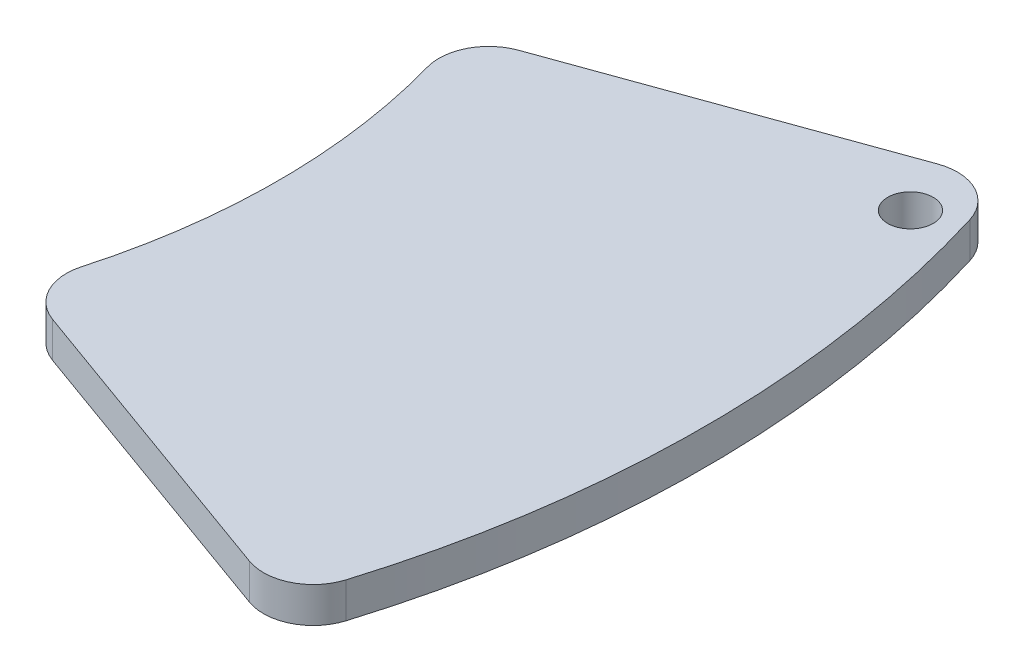
ISO-10303-21;
HEADER;
FILE_DESCRIPTION(('STEP AP214'),'2;1');
FILE_NAME('part.step','',(''),(''),'','','');
FILE_SCHEMA(('AUTOMOTIVE_DESIGN { 1 0 10303 214 1 1 1 1 }'));
ENDSEC;
DATA;
#1=APPLICATION_CONTEXT('core data for automotive mechanical design processes');
#2=APPLICATION_PROTOCOL_DEFINITION('international standard','automotive_design',2000,#1);
#3=PRODUCT_CONTEXT('',#1,'mechanical');
#4=PRODUCT('Part','Part','',(#3));
#5=PRODUCT_RELATED_PRODUCT_CATEGORY('part','',(#4));
#6=PRODUCT_DEFINITION_FORMATION('','',#4);
#7=PRODUCT_DEFINITION_CONTEXT('part definition',#1,'design');
#8=PRODUCT_DEFINITION('design','',#6,#7);
#9=PRODUCT_DEFINITION_SHAPE('','',#8);
#10=(LENGTH_UNIT() NAMED_UNIT(*) SI_UNIT(.MILLI.,.METRE.));
#11=(NAMED_UNIT(*) PLANE_ANGLE_UNIT() SI_UNIT($,.RADIAN.));
#12=(NAMED_UNIT(*) SI_UNIT($,.STERADIAN.) SOLID_ANGLE_UNIT());
#13=UNCERTAINTY_MEASURE_WITH_UNIT(LENGTH_MEASURE(1.E-05),#10,'distance_accuracy_value','');
#14=(GEOMETRIC_REPRESENTATION_CONTEXT(3) GLOBAL_UNCERTAINTY_ASSIGNED_CONTEXT((#13)) GLOBAL_UNIT_ASSIGNED_CONTEXT((#10,
#11,#12)) REPRESENTATION_CONTEXT('',''));
#15=CARTESIAN_POINT('',(0.,0.,0.));
#16=DIRECTION('',(0.,0.,1.));
#17=DIRECTION('',(1.,0.,0.));
#18=AXIS2_PLACEMENT_3D('',#15,#16,#17);
#19=CARTESIAN_POINT('',(0.,3.175,0.));
#20=DIRECTION('',(0.,-1.,0.));
#21=DIRECTION('',(0.,0.,-1.));
#22=AXIS2_PLACEMENT_3D('',#19,#20,#21);
#23=CYLINDRICAL_SURFACE('',#22,57.15);
#24=CARTESIAN_POINT('',(0.,0.,0.));
#25=DIRECTION('',(0.,-1.,0.));
#26=DIRECTION('',(0.,0.,1.));
#27=AXIS2_PLACEMENT_3D('',#24,#25,#26);
#28=CIRCLE('',#27,57.15);
#29=CARTESIAN_POINT('',(55.0227797120916,0.,-15.4472072801085));
#30=VERTEX_POINT('',#29);
#31=CARTESIAN_POINT('',(55.0227797120916,0.,15.4472072801085));
#32=VERTEX_POINT('',#31);
#33=EDGE_CURVE('E160',#30,#32,#28,.T.);
#34=ORIENTED_EDGE('',*,*,#33,.T.);
#35=DIRECTION('',(0.,-1.,0.));
#36=VECTOR('',#35,1.);
#37=CARTESIAN_POINT('',(55.0227797120916,3.175,15.4472072801085));
#38=LINE('',#37,#36);
#39=CARTESIAN_POINT('',(55.0227797120916,3.175,15.4472072801085));
#40=VERTEX_POINT('',#39);
#41=EDGE_CURVE('E135',#32,#40,#38,.F.);
#42=ORIENTED_EDGE('',*,*,#41,.T.);
#43=CARTESIAN_POINT('',(0.,3.175,0.));
#44=DIRECTION('',(0.,-1.,0.));
#45=DIRECTION('',(0.,0.,1.));
#46=AXIS2_PLACEMENT_3D('',#43,#44,#45);
#47=CIRCLE('',#46,57.15);
#48=CARTESIAN_POINT('',(55.0227797120916,3.175,-15.4472072801085));
#49=VERTEX_POINT('',#48);
#50=EDGE_CURVE('E173',#49,#40,#47,.T.);
#51=ORIENTED_EDGE('',*,*,#50,.F.);
#52=DIRECTION('',(0.,-1.,0.));
#53=VECTOR('',#52,1.);
#54=CARTESIAN_POINT('',(55.0227797120916,3.175,-15.4472072801085));
#55=LINE('',#54,#53);
#56=EDGE_CURVE('E141',#49,#30,#55,.T.);
#57=ORIENTED_EDGE('',*,*,#56,.T.);
#58=EDGE_LOOP('',(#34,#42,#51,#57));
#59=FACE_BOUND('',#58,.T.);
#60=ADVANCED_FACE('F49',(#59),#23,.F.);
#61=CARTESIAN_POINT('',(53.764572513815,3.175,19.3776480101875));
#62=DIRECTION('',(0.339066456871172,0.,-0.940762423688802));
#63=DIRECTION('',(-0.940762423688802,0.,-0.339066456871172));
#64=AXIS2_PLACEMENT_3D('',#61,#62,#63);
#65=PLANE('',#64);
#66=DIRECTION('',(0.940762423688802,0.,0.339066456871172));
#67=VECTOR('',#66,1.);
#68=CARTESIAN_POINT('',(53.764572513815,3.175,19.3776480101875));
#69=LINE('',#68,#67);
#70=CARTESIAN_POINT('',(57.7951788444619,3.175,20.8303457085248));
#71=VERTEX_POINT('',#70);
#72=CARTESIAN_POINT('',(85.3235214663583,3.175,30.7520191951666));
#73=VERTEX_POINT('',#72);
#74=EDGE_CURVE('E151',#71,#73,#69,.T.);
#75=ORIENTED_EDGE('',*,*,#74,.F.);
#76=DIRECTION('',(0.,-1.,0.));
#77=VECTOR('',#76,1.);
#78=CARTESIAN_POINT('',(57.7951788444619,3.175,20.8303457085248));
#79=LINE('',#78,#77);
#80=CARTESIAN_POINT('',(57.7951788444619,0.,20.8303457085248));
#81=VERTEX_POINT('',#80);
#82=EDGE_CURVE('E134',#71,#81,#79,.T.);
#83=ORIENTED_EDGE('',*,*,#82,.T.);
#84=DIRECTION('',(0.940762423688802,0.,0.339066456871172));
#85=VECTOR('',#84,1.);
#86=CARTESIAN_POINT('',(53.764572513815,0.,19.3776480101875));
#87=LINE('',#86,#85);
#88=CARTESIAN_POINT('',(85.3235214663583,0.,30.7520191951666));
#89=VERTEX_POINT('',#88);
#90=EDGE_CURVE('E148',#81,#89,#87,.T.);
#91=ORIENTED_EDGE('',*,*,#90,.T.);
#92=DIRECTION('',(0.,-1.,0.));
#93=VECTOR('',#92,1.);
#94=CARTESIAN_POINT('',(85.3235214663583,3.175,30.7520191951666));
#95=LINE('',#94,#93);
#96=EDGE_CURVE('E154',#89,#73,#95,.F.);
#97=ORIENTED_EDGE('',*,*,#96,.T.);
#98=EDGE_LOOP('',(#75,#83,#91,#97));
#99=FACE_BOUND('',#98,.T.);
#100=ADVANCED_FACE('F147',(#99),#65,.F.);
#101=CARTESIAN_POINT('',(0.,3.175,0.));
#102=DIRECTION('',(0.,-1.,0.));
#103=DIRECTION('',(0.,0.,-1.));
#104=AXIS2_PLACEMENT_3D('',#101,#102,#103);
#105=CYLINDRICAL_SURFACE('',#104,95.25);
#106=CARTESIAN_POINT('',(0.,0.,0.));
#107=DIRECTION('',(0.,1.,0.));
#108=DIRECTION('',(0.,0.,1.));
#109=AXIS2_PLACEMENT_3D('',#106,#107,#108);
#110=CIRCLE('',#109,95.25);
#111=CARTESIAN_POINT('',(91.081124336172,0.,27.8709757572062));
#112=VERTEX_POINT('',#111);
#113=CARTESIAN_POINT('',(91.081124336172,0.,-27.8709757572062));
#114=VERTEX_POINT('',#113);
#115=EDGE_CURVE('E159',#112,#114,#110,.T.);
#116=ORIENTED_EDGE('',*,*,#115,.T.);
#117=DIRECTION('',(0.,-1.,0.));
#118=VECTOR('',#117,1.);
#119=CARTESIAN_POINT('',(91.081124336172,3.175,-27.8709757572062));
#120=LINE('',#119,#118);
#121=CARTESIAN_POINT('',(91.081124336172,3.175,-27.8709757572062));
#122=VERTEX_POINT('',#121);
#123=EDGE_CURVE('E11',#114,#122,#120,.F.);
#124=ORIENTED_EDGE('',*,*,#123,.T.);
#125=CARTESIAN_POINT('',(0.,3.175,0.));
#126=DIRECTION('',(0.,1.,0.));
#127=DIRECTION('',(0.,0.,1.));
#128=AXIS2_PLACEMENT_3D('',#125,#126,#127);
#129=CIRCLE('',#128,95.25);
#130=CARTESIAN_POINT('',(91.081124336172,3.175,27.8709757572062));
#131=VERTEX_POINT('',#130);
#132=EDGE_CURVE('E212',#131,#122,#129,.T.);
#133=ORIENTED_EDGE('',*,*,#132,.F.);
#134=DIRECTION('',(0.,-1.,0.));
#135=VECTOR('',#134,1.);
#136=CARTESIAN_POINT('',(91.081124336172,3.175,27.8709757572062));
#137=LINE('',#136,#135);
#138=EDGE_CURVE('E58',#131,#112,#137,.T.);
#139=ORIENTED_EDGE('',*,*,#138,.T.);
#140=EDGE_LOOP('',(#116,#124,#133,#139));
#141=FACE_BOUND('',#140,.T.);
#142=ADVANCED_FACE('F210',(#141),#105,.T.);
#143=CARTESIAN_POINT('',(53.764572513815,3.175,-19.3776480101875));
#144=DIRECTION('',(0.339066456871173,0.,0.940762423688802));
#145=DIRECTION('',(0.940762423688802,0.,-0.339066456871173));
#146=AXIS2_PLACEMENT_3D('',#143,#144,#145);
#147=PLANE('',#146);
#148=DIRECTION('',(-0.940762423688802,0.,0.339066456871173));
#149=VECTOR('',#148,1.);
#150=CARTESIAN_POINT('',(53.764572513815,0.,-19.3776480101875));
#151=LINE('',#150,#149);
#152=CARTESIAN_POINT('',(85.3235214663583,0.,-30.7520191951666));
#153=VERTEX_POINT('',#152);
#154=CARTESIAN_POINT('',(57.7951788444619,0.,-20.8303457085248));
#155=VERTEX_POINT('',#154);
#156=EDGE_CURVE('E165',#153,#155,#151,.T.);
#157=ORIENTED_EDGE('',*,*,#156,.T.);
#158=DIRECTION('',(0.,-1.,0.));
#159=VECTOR('',#158,1.);
#160=CARTESIAN_POINT('',(57.7951788444619,3.175,-20.8303457085248));
#161=LINE('',#160,#159);
#162=CARTESIAN_POINT('',(57.7951788444619,3.175,-20.8303457085248));
#163=VERTEX_POINT('',#162);
#164=EDGE_CURVE('E68',#155,#163,#161,.F.);
#165=ORIENTED_EDGE('',*,*,#164,.T.);
#166=DIRECTION('',(-0.940762423688802,0.,0.339066456871173));
#167=VECTOR('',#166,1.);
#168=CARTESIAN_POINT('',(53.764572513815,3.175,-19.3776480101875));
#169=LINE('',#168,#167);
#170=CARTESIAN_POINT('',(85.3235214663583,3.175,-30.7520191951666));
#171=VERTEX_POINT('',#170);
#172=EDGE_CURVE('E175',#171,#163,#169,.T.);
#173=ORIENTED_EDGE('',*,*,#172,.F.);
#174=DIRECTION('',(0.,-1.,0.));
#175=VECTOR('',#174,1.);
#176=CARTESIAN_POINT('',(85.3235214663583,3.175,-30.7520191951666));
#177=LINE('',#176,#175);
#178=EDGE_CURVE('E200',#171,#153,#177,.T.);
#179=ORIENTED_EDGE('',*,*,#178,.T.);
#180=EDGE_LOOP('',(#157,#165,#173,#179));
#181=FACE_BOUND('',#180,.T.);
#182=ADVANCED_FACE('F219',(#181),#147,.F.);
#183=CARTESIAN_POINT('',(0.,3.175,0.));
#184=DIRECTION('',(0.,1.,0.));
#185=DIRECTION('',(0.,0.,1.));
#186=AXIS2_PLACEMENT_3D('',#183,#184,#185);
#187=PLANE('',#186);
#188=CARTESIAN_POINT('',(87.7026208563584,3.175,-25.9460800169792));
#189=DIRECTION('',(0.,1.,0.));
#190=DIRECTION('',(0.,0.,1.));
#191=AXIS2_PLACEMENT_3D('',#188,#189,#190);
#192=CIRCLE('',#191,2.03200000000001);
#193=CARTESIAN_POINT('',(87.7026208563584,3.175,-23.9140800169792));
#194=VERTEX_POINT('',#193);
#195=EDGE_CURVE('E230',#194,#194,#192,.T.);
#196=ORIENTED_EDGE('',*,*,#195,.F.);
#197=EDGE_LOOP('',(#196));
#198=FACE_BOUND('',#197,.T.);
#199=ORIENTED_EDGE('',*,*,#50,.T.);
#200=CARTESIAN_POINT('',(59.3023292452543,3.175,16.6486567352281));
#201=DIRECTION('',(0.,1.,0.));
#202=DIRECTION('',(0.,0.,1.));
#203=AXIS2_PLACEMENT_3D('',#200,#201,#202);
#204=CIRCLE('',#203,4.445);
#205=EDGE_CURVE('E197',#40,#71,#204,.T.);
#206=ORIENTED_EDGE('',*,*,#205,.T.);
#207=ORIENTED_EDGE('',*,*,#74,.T.);
#208=CARTESIAN_POINT('',(86.8306718671506,3.175,26.5703302218699));
#209=DIRECTION('',(0.,1.,0.));
#210=DIRECTION('',(0.,0.,1.));
#211=AXIS2_PLACEMENT_3D('',#208,#209,#210);
#212=CIRCLE('',#211,4.445);
#213=EDGE_CURVE('E189',#73,#131,#212,.T.);
#214=ORIENTED_EDGE('',*,*,#213,.T.);
#215=ORIENTED_EDGE('',*,*,#132,.T.);
#216=CARTESIAN_POINT('',(86.8306718671506,3.175,-26.5703302218699));
#217=DIRECTION('',(0.,1.,0.));
#218=DIRECTION('',(0.,0.,1.));
#219=AXIS2_PLACEMENT_3D('',#216,#217,#218);
#220=CIRCLE('',#219,4.445);
#221=EDGE_CURVE('E77',#122,#171,#220,.T.);
#222=ORIENTED_EDGE('',*,*,#221,.T.);
#223=ORIENTED_EDGE('',*,*,#172,.T.);
#224=CARTESIAN_POINT('',(59.3023292452543,3.175,-16.6486567352281));
#225=DIRECTION('',(0.,1.,0.));
#226=DIRECTION('',(0.,0.,1.));
#227=AXIS2_PLACEMENT_3D('',#224,#225,#226);
#228=CIRCLE('',#227,4.445);
#229=EDGE_CURVE('E194',#163,#49,#228,.T.);
#230=ORIENTED_EDGE('',*,*,#229,.T.);
#231=EDGE_LOOP('',(#199,#206,#207,#214,#215,#222,#223,#230));
#232=FACE_BOUND('',#231,.T.);
#233=ADVANCED_FACE('F245',(#198,#232),#187,.T.);
#234=CARTESIAN_POINT('',(0.,0.,0.));
#235=DIRECTION('',(0.,1.,0.));
#236=DIRECTION('',(0.,0.,1.));
#237=AXIS2_PLACEMENT_3D('',#234,#235,#236);
#238=PLANE('',#237);
#239=CARTESIAN_POINT('',(87.7026208563584,0.,-25.9460800169792));
#240=DIRECTION('',(0.,1.,0.));
#241=DIRECTION('',(0.,0.,1.));
#242=AXIS2_PLACEMENT_3D('',#239,#240,#241);
#243=CIRCLE('',#242,2.03200000000001);
#244=CARTESIAN_POINT('',(87.7026208563584,0.,-23.9140800169792));
#245=VERTEX_POINT('',#244);
#246=EDGE_CURVE('E167',#245,#245,#243,.T.);
#247=ORIENTED_EDGE('',*,*,#246,.T.);
#248=EDGE_LOOP('',(#247));
#249=FACE_BOUND('',#248,.T.);
#250=ORIENTED_EDGE('',*,*,#90,.F.);
#251=CARTESIAN_POINT('',(59.3023292452543,0.,16.6486567352281));
#252=DIRECTION('',(0.,1.,0.));
#253=DIRECTION('',(0.,0.,1.));
#254=AXIS2_PLACEMENT_3D('',#251,#252,#253);
#255=CIRCLE('',#254,4.445);
#256=EDGE_CURVE('E130',#81,#32,#255,.F.);
#257=ORIENTED_EDGE('',*,*,#256,.T.);
#258=ORIENTED_EDGE('',*,*,#33,.F.);
#259=CARTESIAN_POINT('',(59.3023292452543,0.,-16.6486567352281));
#260=DIRECTION('',(0.,1.,0.));
#261=DIRECTION('',(0.,0.,1.));
#262=AXIS2_PLACEMENT_3D('',#259,#260,#261);
#263=CIRCLE('',#262,4.445);
#264=EDGE_CURVE('E142',#30,#155,#263,.F.);
#265=ORIENTED_EDGE('',*,*,#264,.T.);
#266=ORIENTED_EDGE('',*,*,#156,.F.);
#267=CARTESIAN_POINT('',(86.8306718671506,0.,-26.5703302218699));
#268=DIRECTION('',(0.,1.,0.));
#269=DIRECTION('',(0.,0.,1.));
#270=AXIS2_PLACEMENT_3D('',#267,#268,#269);
#271=CIRCLE('',#270,4.445);
#272=EDGE_CURVE('E179',#153,#114,#271,.F.);
#273=ORIENTED_EDGE('',*,*,#272,.T.);
#274=ORIENTED_EDGE('',*,*,#115,.F.);
#275=CARTESIAN_POINT('',(86.8306718671506,0.,26.5703302218699));
#276=DIRECTION('',(0.,1.,0.));
#277=DIRECTION('',(0.,0.,1.));
#278=AXIS2_PLACEMENT_3D('',#275,#276,#277);
#279=CIRCLE('',#278,4.445);
#280=EDGE_CURVE('E153',#112,#89,#279,.F.);
#281=ORIENTED_EDGE('',*,*,#280,.T.);
#282=EDGE_LOOP('',(#250,#257,#258,#265,#266,#273,#274,#281));
#283=FACE_BOUND('',#282,.T.);
#284=ADVANCED_FACE('F156',(#249,#283),#238,.F.);
#285=CARTESIAN_POINT('',(87.7026208563584,0.,-25.9460800169792));
#286=DIRECTION('',(0.,1.,0.));
#287=DIRECTION('',(0.,0.,1.));
#288=AXIS2_PLACEMENT_3D('',#285,#286,#287);
#289=CYLINDRICAL_SURFACE('',#288,2.03200000000001);
#290=ORIENTED_EDGE('',*,*,#246,.F.);
#291=EDGE_LOOP('',(#290));
#292=FACE_BOUND('',#291,.T.);
#293=ORIENTED_EDGE('',*,*,#195,.T.);
#294=EDGE_LOOP('',(#293));
#295=FACE_BOUND('',#294,.T.);
#296=ADVANCED_FACE('F239',(#292,#295),#289,.F.);
#297=CARTESIAN_POINT('',(59.3023292452543,3.175,16.6486567352281));
#298=DIRECTION('',(0.,-1.,0.));
#299=DIRECTION('',(0.,0.,-1.));
#300=AXIS2_PLACEMENT_3D('',#297,#298,#299);
#301=CYLINDRICAL_SURFACE('',#300,4.445);
#302=ORIENTED_EDGE('',*,*,#205,.F.);
#303=ORIENTED_EDGE('',*,*,#41,.F.);
#304=ORIENTED_EDGE('',*,*,#256,.F.);
#305=ORIENTED_EDGE('',*,*,#82,.F.);
#306=EDGE_LOOP('',(#302,#303,#304,#305));
#307=FACE_BOUND('',#306,.T.);
#308=ADVANCED_FACE('F133',(#307),#301,.T.);
#309=CARTESIAN_POINT('',(59.3023292452543,3.175,-16.6486567352281));
#310=DIRECTION('',(0.,-1.,0.));
#311=DIRECTION('',(0.,0.,-1.));
#312=AXIS2_PLACEMENT_3D('',#309,#310,#311);
#313=CYLINDRICAL_SURFACE('',#312,4.445);
#314=ORIENTED_EDGE('',*,*,#229,.F.);
#315=ORIENTED_EDGE('',*,*,#164,.F.);
#316=ORIENTED_EDGE('',*,*,#264,.F.);
#317=ORIENTED_EDGE('',*,*,#56,.F.);
#318=EDGE_LOOP('',(#314,#315,#316,#317));
#319=FACE_BOUND('',#318,.T.);
#320=ADVANCED_FACE('F252',(#319),#313,.T.);
#321=CARTESIAN_POINT('',(86.8306718671506,3.175,-26.5703302218699));
#322=DIRECTION('',(0.,-1.,0.));
#323=DIRECTION('',(0.,0.,-1.));
#324=AXIS2_PLACEMENT_3D('',#321,#322,#323);
#325=CYLINDRICAL_SURFACE('',#324,4.445);
#326=ORIENTED_EDGE('',*,*,#221,.F.);
#327=ORIENTED_EDGE('',*,*,#123,.F.);
#328=ORIENTED_EDGE('',*,*,#272,.F.);
#329=ORIENTED_EDGE('',*,*,#178,.F.);
#330=EDGE_LOOP('',(#326,#327,#328,#329));
#331=FACE_BOUND('',#330,.T.);
#332=ADVANCED_FACE('F218',(#331),#325,.T.);
#333=CARTESIAN_POINT('',(86.8306718671506,3.175,26.5703302218699));
#334=DIRECTION('',(0.,-1.,0.));
#335=DIRECTION('',(0.,0.,-1.));
#336=AXIS2_PLACEMENT_3D('',#333,#334,#335);
#337=CYLINDRICAL_SURFACE('',#336,4.445);
#338=ORIENTED_EDGE('',*,*,#213,.F.);
#339=ORIENTED_EDGE('',*,*,#96,.F.);
#340=ORIENTED_EDGE('',*,*,#280,.F.);
#341=ORIENTED_EDGE('',*,*,#138,.F.);
#342=EDGE_LOOP('',(#338,#339,#340,#341));
#343=FACE_BOUND('',#342,.T.);
#344=ADVANCED_FACE('F51',(#343),#337,.T.);
#345=CLOSED_SHELL('',(#60,#100,#142,#182,#233,#284,#296,#308,#320,#332,#344));
#346=MANIFOLD_SOLID_BREP('B2',#345);
#347=ADVANCED_BREP_SHAPE_REPRESENTATION('',(#18,#346),#14);
#348=SHAPE_DEFINITION_REPRESENTATION(#9,#347);
ENDSEC;
END-ISO-10303-21;
